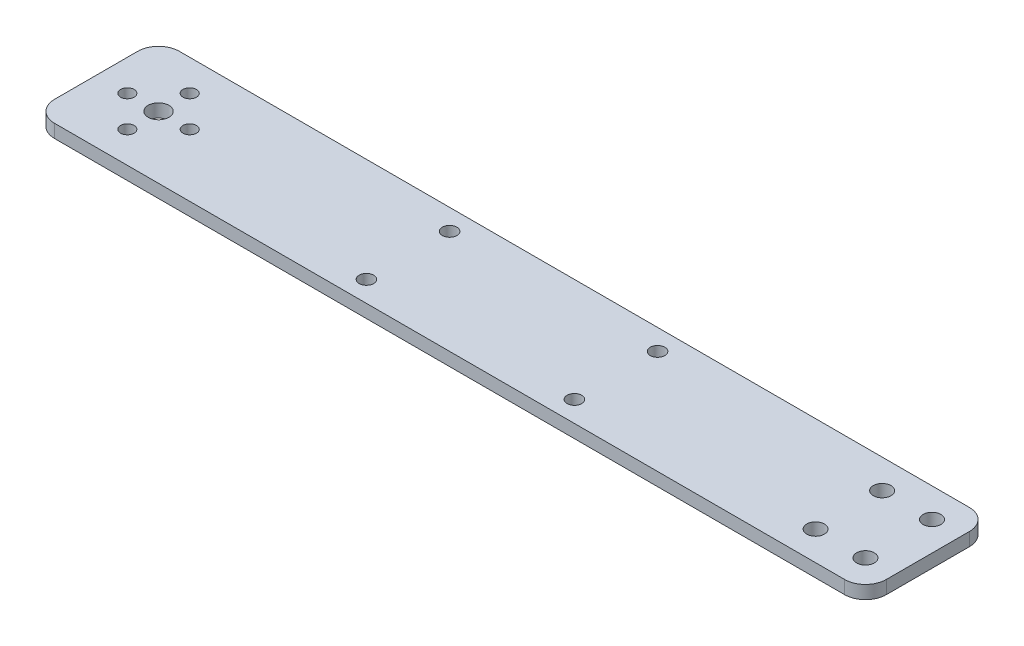
ISO-10303-21;
HEADER;
FILE_DESCRIPTION(('STEP AP214'),'2;1');
FILE_NAME('part.step','',(''),(''),'','','');
FILE_SCHEMA(('AUTOMOTIVE_DESIGN { 1 0 10303 214 1 1 1 1 }'));
ENDSEC;
DATA;
#1=APPLICATION_CONTEXT('core data for automotive mechanical design processes');
#2=APPLICATION_PROTOCOL_DEFINITION('international standard','automotive_design',2000,#1);
#3=PRODUCT_CONTEXT('',#1,'mechanical');
#4=PRODUCT('Part','Part','',(#3));
#5=PRODUCT_RELATED_PRODUCT_CATEGORY('part','',(#4));
#6=PRODUCT_DEFINITION_FORMATION('','',#4);
#7=PRODUCT_DEFINITION_CONTEXT('part definition',#1,'design');
#8=PRODUCT_DEFINITION('design','',#6,#7);
#9=PRODUCT_DEFINITION_SHAPE('','',#8);
#10=(LENGTH_UNIT() NAMED_UNIT(*) SI_UNIT(.MILLI.,.METRE.));
#11=(NAMED_UNIT(*) PLANE_ANGLE_UNIT() SI_UNIT($,.RADIAN.));
#12=(NAMED_UNIT(*) SI_UNIT($,.STERADIAN.) SOLID_ANGLE_UNIT());
#13=UNCERTAINTY_MEASURE_WITH_UNIT(LENGTH_MEASURE(1.E-05),#10,'distance_accuracy_value','');
#14=(GEOMETRIC_REPRESENTATION_CONTEXT(3) GLOBAL_UNCERTAINTY_ASSIGNED_CONTEXT((#13)) GLOBAL_UNIT_ASSIGNED_CONTEXT((#10,
#11,#12)) REPRESENTATION_CONTEXT('',''));
#15=CARTESIAN_POINT('',(0.,0.,0.));
#16=DIRECTION('',(0.,0.,1.));
#17=DIRECTION('',(1.,0.,0.));
#18=AXIS2_PLACEMENT_3D('',#15,#16,#17);
#19=CARTESIAN_POINT('',(-15.,3.175,-15.));
#20=DIRECTION('',(1.,0.,0.));
#21=DIRECTION('',(0.,0.,-1.));
#22=AXIS2_PLACEMENT_3D('',#19,#20,#21);
#23=PLANE('',#22);
#24=DIRECTION('',(0.,0.,1.));
#25=VECTOR('',#24,1.);
#26=CARTESIAN_POINT('',(-15.,3.175,-15.));
#27=LINE('',#26,#25);
#28=CARTESIAN_POINT('',(-15.,3.175,-10.));
#29=VERTEX_POINT('',#28);
#30=CARTESIAN_POINT('',(-15.,3.175,10.));
#31=VERTEX_POINT('',#30);
#32=EDGE_CURVE('E130',#29,#31,#27,.T.);
#33=ORIENTED_EDGE('',*,*,#32,.F.);
#34=DIRECTION('',(0.,-1.,0.));
#35=VECTOR('',#34,1.);
#36=CARTESIAN_POINT('',(-15.,3.175,-10.));
#37=LINE('',#36,#35);
#38=CARTESIAN_POINT('',(-15.,0.,-10.));
#39=VERTEX_POINT('',#38);
#40=EDGE_CURVE('E11',#29,#39,#37,.T.);
#41=ORIENTED_EDGE('',*,*,#40,.T.);
#42=DIRECTION('',(0.,0.,1.));
#43=VECTOR('',#42,1.);
#44=CARTESIAN_POINT('',(-15.,0.,-15.));
#45=LINE('',#44,#43);
#46=CARTESIAN_POINT('',(-15.,0.,10.));
#47=VERTEX_POINT('',#46);
#48=EDGE_CURVE('E132',#39,#47,#45,.T.);
#49=ORIENTED_EDGE('',*,*,#48,.T.);
#50=DIRECTION('',(0.,-1.,0.));
#51=VECTOR('',#50,1.);
#52=CARTESIAN_POINT('',(-15.,3.175,10.));
#53=LINE('',#52,#51);
#54=EDGE_CURVE('E42',#47,#31,#53,.F.);
#55=ORIENTED_EDGE('',*,*,#54,.T.);
#56=EDGE_LOOP('',(#33,#41,#49,#55));
#57=FACE_BOUND('',#56,.T.);
#58=ADVANCED_FACE('F33',(#57),#23,.F.);
#59=CARTESIAN_POINT('',(-15.,3.175,15.));
#60=DIRECTION('',(0.,0.,-1.));
#61=DIRECTION('',(-1.,0.,0.));
#62=AXIS2_PLACEMENT_3D('',#59,#60,#61);
#63=PLANE('',#62);
#64=DIRECTION('',(1.,0.,0.));
#65=VECTOR('',#64,1.);
#66=CARTESIAN_POINT('',(-15.,0.,15.));
#67=LINE('',#66,#65);
#68=CARTESIAN_POINT('',(-9.99999999999999,0.,15.));
#69=VERTEX_POINT('',#68);
#70=CARTESIAN_POINT('',(180.,0.,15.));
#71=VERTEX_POINT('',#70);
#72=EDGE_CURVE('E128',#69,#71,#67,.T.);
#73=ORIENTED_EDGE('',*,*,#72,.T.);
#74=DIRECTION('',(0.,-1.,0.));
#75=VECTOR('',#74,1.);
#76=CARTESIAN_POINT('',(180.,3.175,15.));
#77=LINE('',#76,#75);
#78=CARTESIAN_POINT('',(180.,3.175,15.));
#79=VERTEX_POINT('',#78);
#80=EDGE_CURVE('E107',#71,#79,#77,.F.);
#81=ORIENTED_EDGE('',*,*,#80,.T.);
#82=DIRECTION('',(1.,0.,0.));
#83=VECTOR('',#82,1.);
#84=CARTESIAN_POINT('',(-15.,3.175,15.));
#85=LINE('',#84,#83);
#86=CARTESIAN_POINT('',(-9.99999999999999,3.175,15.));
#87=VERTEX_POINT('',#86);
#88=EDGE_CURVE('E190',#87,#79,#85,.T.);
#89=ORIENTED_EDGE('',*,*,#88,.F.);
#90=DIRECTION('',(0.,-1.,0.));
#91=VECTOR('',#90,1.);
#92=CARTESIAN_POINT('',(-9.99999999999999,3.175,15.));
#93=LINE('',#92,#91);
#94=EDGE_CURVE('E112',#87,#69,#93,.T.);
#95=ORIENTED_EDGE('',*,*,#94,.T.);
#96=EDGE_LOOP('',(#73,#81,#89,#95));
#97=FACE_BOUND('',#96,.T.);
#98=ADVANCED_FACE('F206',(#97),#63,.F.);
#99=CARTESIAN_POINT('',(185.,3.175,-15.));
#100=DIRECTION('',(-1.,0.,0.));
#101=DIRECTION('',(0.,0.,1.));
#102=AXIS2_PLACEMENT_3D('',#99,#100,#101);
#103=PLANE('',#102);
#104=DIRECTION('',(0.,0.,-1.));
#105=VECTOR('',#104,1.);
#106=CARTESIAN_POINT('',(185.,3.175,-15.));
#107=LINE('',#106,#105);
#108=CARTESIAN_POINT('',(185.,3.175,10.));
#109=VERTEX_POINT('',#108);
#110=CARTESIAN_POINT('',(185.,3.175,-10.));
#111=VERTEX_POINT('',#110);
#112=EDGE_CURVE('E121',#109,#111,#107,.T.);
#113=ORIENTED_EDGE('',*,*,#112,.F.);
#114=DIRECTION('',(0.,-1.,0.));
#115=VECTOR('',#114,1.);
#116=CARTESIAN_POINT('',(185.,3.175,10.));
#117=LINE('',#116,#115);
#118=CARTESIAN_POINT('',(185.,0.,10.));
#119=VERTEX_POINT('',#118);
#120=EDGE_CURVE('E106',#109,#119,#117,.T.);
#121=ORIENTED_EDGE('',*,*,#120,.T.);
#122=DIRECTION('',(0.,0.,-1.));
#123=VECTOR('',#122,1.);
#124=CARTESIAN_POINT('',(185.,0.,-15.));
#125=LINE('',#124,#123);
#126=CARTESIAN_POINT('',(185.,0.,-10.));
#127=VERTEX_POINT('',#126);
#128=EDGE_CURVE('E119',#119,#127,#125,.T.);
#129=ORIENTED_EDGE('',*,*,#128,.T.);
#130=DIRECTION('',(0.,-1.,0.));
#131=VECTOR('',#130,1.);
#132=CARTESIAN_POINT('',(185.,3.175,-10.));
#133=LINE('',#132,#131);
#134=EDGE_CURVE('E123',#127,#111,#133,.F.);
#135=ORIENTED_EDGE('',*,*,#134,.T.);
#136=EDGE_LOOP('',(#113,#121,#129,#135));
#137=FACE_BOUND('',#136,.T.);
#138=ADVANCED_FACE('F118',(#137),#103,.F.);
#139=CARTESIAN_POINT('',(-15.,3.175,-15.));
#140=DIRECTION('',(0.,0.,1.));
#141=DIRECTION('',(1.,0.,0.));
#142=AXIS2_PLACEMENT_3D('',#139,#140,#141);
#143=PLANE('',#142);
#144=DIRECTION('',(-1.,0.,0.));
#145=VECTOR('',#144,1.);
#146=CARTESIAN_POINT('',(-15.,3.175,-15.));
#147=LINE('',#146,#145);
#148=CARTESIAN_POINT('',(180.,3.175,-15.));
#149=VERTEX_POINT('',#148);
#150=CARTESIAN_POINT('',(-9.99999999999999,3.175,-15.));
#151=VERTEX_POINT('',#150);
#152=EDGE_CURVE('E136',#149,#151,#147,.T.);
#153=ORIENTED_EDGE('',*,*,#152,.F.);
#154=DIRECTION('',(0.,-1.,0.));
#155=VECTOR('',#154,1.);
#156=CARTESIAN_POINT('',(180.,3.175,-15.));
#157=LINE('',#156,#155);
#158=CARTESIAN_POINT('',(180.,0.,-15.));
#159=VERTEX_POINT('',#158);
#160=EDGE_CURVE('E153',#149,#159,#157,.T.);
#161=ORIENTED_EDGE('',*,*,#160,.T.);
#162=DIRECTION('',(-1.,0.,0.));
#163=VECTOR('',#162,1.);
#164=CARTESIAN_POINT('',(-15.,0.,-15.));
#165=LINE('',#164,#163);
#166=CARTESIAN_POINT('',(-9.99999999999999,0.,-15.));
#167=VERTEX_POINT('',#166);
#168=EDGE_CURVE('E127',#159,#167,#165,.T.);
#169=ORIENTED_EDGE('',*,*,#168,.T.);
#170=DIRECTION('',(0.,-1.,0.));
#171=VECTOR('',#170,1.);
#172=CARTESIAN_POINT('',(-9.99999999999999,3.175,-15.));
#173=LINE('',#172,#171);
#174=EDGE_CURVE('E50',#167,#151,#173,.F.);
#175=ORIENTED_EDGE('',*,*,#174,.T.);
#176=EDGE_LOOP('',(#153,#161,#169,#175));
#177=FACE_BOUND('',#176,.T.);
#178=ADVANCED_FACE('F213',(#177),#143,.F.);
#179=CARTESIAN_POINT('',(0.,3.175,0.));
#180=DIRECTION('',(0.,1.,0.));
#181=DIRECTION('',(0.,0.,1.));
#182=AXIS2_PLACEMENT_3D('',#179,#180,#181);
#183=PLANE('',#182);
#184=CARTESIAN_POINT('',(166.,3.175,8.00000000000001));
#185=DIRECTION('',(0.,1.,0.));
#186=DIRECTION('',(0.,0.,-1.));
#187=AXIS2_PLACEMENT_3D('',#184,#185,#186);
#188=CIRCLE('',#187,2.12499999999998);
#189=CARTESIAN_POINT('',(166.,3.175,5.87500000000003));
#190=VERTEX_POINT('',#189);
#191=EDGE_CURVE('E315',#190,#190,#188,.T.);
#192=ORIENTED_EDGE('',*,*,#191,.F.);
#193=EDGE_LOOP('',(#192));
#194=FACE_BOUND('',#193,.T.);
#195=CARTESIAN_POINT('',(178.,3.175,8.00000000000001));
#196=DIRECTION('',(0.,1.,0.));
#197=DIRECTION('',(0.,0.,1.));
#198=AXIS2_PLACEMENT_3D('',#195,#196,#197);
#199=CIRCLE('',#198,2.12499999999998);
#200=CARTESIAN_POINT('',(178.,3.175,10.125));
#201=VERTEX_POINT('',#200);
#202=EDGE_CURVE('E307',#201,#201,#199,.T.);
#203=ORIENTED_EDGE('',*,*,#202,.F.);
#204=EDGE_LOOP('',(#203));
#205=FACE_BOUND('',#204,.T.);
#206=CARTESIAN_POINT('',(178.,3.175,-7.99999999999999));
#207=DIRECTION('',(0.,1.,0.));
#208=DIRECTION('',(0.,0.,-1.));
#209=AXIS2_PLACEMENT_3D('',#206,#207,#208);
#210=CIRCLE('',#209,2.12499999999998);
#211=CARTESIAN_POINT('',(178.,3.175,-10.125));
#212=VERTEX_POINT('',#211);
#213=EDGE_CURVE('E300',#212,#212,#210,.T.);
#214=ORIENTED_EDGE('',*,*,#213,.F.);
#215=EDGE_LOOP('',(#214));
#216=FACE_BOUND('',#215,.T.);
#217=CARTESIAN_POINT('',(166.,3.175,-7.99999999999999));
#218=DIRECTION('',(0.,1.,0.));
#219=DIRECTION('',(0.,0.,1.));
#220=AXIS2_PLACEMENT_3D('',#217,#218,#219);
#221=CIRCLE('',#220,2.12499999999998);
#222=CARTESIAN_POINT('',(166.,3.175,-5.87500000000002));
#223=VERTEX_POINT('',#222);
#224=EDGE_CURVE('E304',#223,#223,#221,.T.);
#225=ORIENTED_EDGE('',*,*,#224,.F.);
#226=EDGE_LOOP('',(#225));
#227=FACE_BOUND('',#226,.T.);
#228=CARTESIAN_POINT('',(60.,3.175,-9.99999999999999));
#229=DIRECTION('',(0.,1.,0.));
#230=DIRECTION('',(0.,0.,-1.));
#231=AXIS2_PLACEMENT_3D('',#228,#229,#230);
#232=CIRCLE('',#231,1.75);
#233=CARTESIAN_POINT('',(60.,3.175,-11.75));
#234=VERTEX_POINT('',#233);
#235=EDGE_CURVE('E321',#234,#234,#232,.T.);
#236=ORIENTED_EDGE('',*,*,#235,.F.);
#237=EDGE_LOOP('',(#236));
#238=FACE_BOUND('',#237,.T.);
#239=CARTESIAN_POINT('',(110.,3.175,-9.99999999999999));
#240=DIRECTION('',(0.,1.,0.));
#241=DIRECTION('',(0.,0.,1.));
#242=AXIS2_PLACEMENT_3D('',#239,#240,#241);
#243=CIRCLE('',#242,1.75000000000001);
#244=CARTESIAN_POINT('',(110.,3.175,-8.24999999999998));
#245=VERTEX_POINT('',#244);
#246=EDGE_CURVE('E327',#245,#245,#243,.T.);
#247=ORIENTED_EDGE('',*,*,#246,.F.);
#248=EDGE_LOOP('',(#247));
#249=FACE_BOUND('',#248,.T.);
#250=CARTESIAN_POINT('',(110.,3.175,9.99999999999999));
#251=DIRECTION('',(0.,1.,0.));
#252=DIRECTION('',(0.,0.,-1.));
#253=AXIS2_PLACEMENT_3D('',#250,#251,#252);
#254=CIRCLE('',#253,1.75000000000001);
#255=CARTESIAN_POINT('',(110.,3.175,8.24999999999998));
#256=VERTEX_POINT('',#255);
#257=EDGE_CURVE('E324',#256,#256,#254,.T.);
#258=ORIENTED_EDGE('',*,*,#257,.F.);
#259=EDGE_LOOP('',(#258));
#260=FACE_BOUND('',#259,.T.);
#261=CARTESIAN_POINT('',(60.,3.175,9.99999999999999));
#262=DIRECTION('',(0.,1.,0.));
#263=DIRECTION('',(0.,0.,1.));
#264=AXIS2_PLACEMENT_3D('',#261,#262,#263);
#265=CIRCLE('',#264,1.75);
#266=CARTESIAN_POINT('',(60.,3.175,11.75));
#267=VERTEX_POINT('',#266);
#268=EDGE_CURVE('E161',#267,#267,#265,.T.);
#269=ORIENTED_EDGE('',*,*,#268,.F.);
#270=EDGE_LOOP('',(#269));
#271=FACE_BOUND('',#270,.T.);
#272=CARTESIAN_POINT('',(7.5,3.175,0.));
#273=DIRECTION('',(0.,1.,0.));
#274=DIRECTION('',(0.,0.,1.));
#275=AXIS2_PLACEMENT_3D('',#272,#273,#274);
#276=CIRCLE('',#275,1.625);
#277=CARTESIAN_POINT('',(7.5,3.175,1.625));
#278=VERTEX_POINT('',#277);
#279=EDGE_CURVE('E336',#278,#278,#276,.T.);
#280=ORIENTED_EDGE('',*,*,#279,.F.);
#281=EDGE_LOOP('',(#280));
#282=FACE_BOUND('',#281,.T.);
#283=CARTESIAN_POINT('',(0.,3.175,7.5));
#284=DIRECTION('',(0.,1.,0.));
#285=DIRECTION('',(0.,0.,1.));
#286=AXIS2_PLACEMENT_3D('',#283,#284,#285);
#287=CIRCLE('',#286,1.625);
#288=CARTESIAN_POINT('',(0.,3.175,9.125));
#289=VERTEX_POINT('',#288);
#290=EDGE_CURVE('E342',#289,#289,#287,.T.);
#291=ORIENTED_EDGE('',*,*,#290,.F.);
#292=EDGE_LOOP('',(#291));
#293=FACE_BOUND('',#292,.T.);
#294=CARTESIAN_POINT('',(-7.5,3.175,0.));
#295=DIRECTION('',(0.,1.,0.));
#296=DIRECTION('',(0.,0.,1.));
#297=AXIS2_PLACEMENT_3D('',#294,#295,#296);
#298=CIRCLE('',#297,1.625);
#299=CARTESIAN_POINT('',(-7.5,3.175,1.62499999999995));
#300=VERTEX_POINT('',#299);
#301=EDGE_CURVE('E177',#300,#300,#298,.T.);
#302=ORIENTED_EDGE('',*,*,#301,.F.);
#303=EDGE_LOOP('',(#302));
#304=FACE_BOUND('',#303,.T.);
#305=CARTESIAN_POINT('',(0.,3.175,-7.5));
#306=DIRECTION('',(0.,1.,0.));
#307=DIRECTION('',(0.,0.,1.));
#308=AXIS2_PLACEMENT_3D('',#305,#306,#307);
#309=CIRCLE('',#308,1.625);
#310=CARTESIAN_POINT('',(0.,3.175,-5.875));
#311=VERTEX_POINT('',#310);
#312=EDGE_CURVE('E168',#311,#311,#309,.T.);
#313=ORIENTED_EDGE('',*,*,#312,.F.);
#314=EDGE_LOOP('',(#313));
#315=FACE_BOUND('',#314,.T.);
#316=CARTESIAN_POINT('',(0.,3.175,0.));
#317=DIRECTION('',(0.,1.,0.));
#318=DIRECTION('',(0.,0.,1.));
#319=AXIS2_PLACEMENT_3D('',#316,#317,#318);
#320=CIRCLE('',#319,2.5);
#321=CARTESIAN_POINT('',(0.,3.175,2.5));
#322=VERTEX_POINT('',#321);
#323=EDGE_CURVE('E184',#322,#322,#320,.T.);
#324=ORIENTED_EDGE('',*,*,#323,.F.);
#325=EDGE_LOOP('',(#324));
#326=FACE_BOUND('',#325,.T.);
#327=ORIENTED_EDGE('',*,*,#88,.T.);
#328=CARTESIAN_POINT('',(180.,3.175,10.));
#329=DIRECTION('',(0.,1.,0.));
#330=DIRECTION('',(0.,0.,1.));
#331=AXIS2_PLACEMENT_3D('',#328,#329,#330);
#332=CIRCLE('',#331,5.);
#333=EDGE_CURVE('E150',#79,#109,#332,.T.);
#334=ORIENTED_EDGE('',*,*,#333,.T.);
#335=ORIENTED_EDGE('',*,*,#112,.T.);
#336=CARTESIAN_POINT('',(180.,3.175,-10.));
#337=DIRECTION('',(0.,1.,0.));
#338=DIRECTION('',(0.,0.,1.));
#339=AXIS2_PLACEMENT_3D('',#336,#337,#338);
#340=CIRCLE('',#339,5.);
#341=EDGE_CURVE('E57',#111,#149,#340,.T.);
#342=ORIENTED_EDGE('',*,*,#341,.T.);
#343=ORIENTED_EDGE('',*,*,#152,.T.);
#344=CARTESIAN_POINT('',(-9.99999999999999,3.175,-10.));
#345=DIRECTION('',(0.,1.,0.));
#346=DIRECTION('',(0.,0.,1.));
#347=AXIS2_PLACEMENT_3D('',#344,#345,#346);
#348=CIRCLE('',#347,5.);
#349=EDGE_CURVE('E147',#151,#29,#348,.T.);
#350=ORIENTED_EDGE('',*,*,#349,.T.);
#351=ORIENTED_EDGE('',*,*,#32,.T.);
#352=CARTESIAN_POINT('',(-9.99999999999999,3.175,10.));
#353=DIRECTION('',(0.,1.,0.));
#354=DIRECTION('',(0.,0.,1.));
#355=AXIS2_PLACEMENT_3D('',#352,#353,#354);
#356=CIRCLE('',#355,5.);
#357=EDGE_CURVE('E145',#31,#87,#356,.T.);
#358=ORIENTED_EDGE('',*,*,#357,.T.);
#359=EDGE_LOOP('',(#327,#334,#335,#342,#343,#350,#351,#358));
#360=FACE_BOUND('',#359,.T.);
#361=ADVANCED_FACE('F204',(#194,#205,#216,#227,#238,#249,#260,#271,#282,#293,#304,#315,#326,
#360),#183,.T.);
#362=CARTESIAN_POINT('',(0.,0.,0.));
#363=DIRECTION('',(0.,1.,0.));
#364=DIRECTION('',(0.,0.,1.));
#365=AXIS2_PLACEMENT_3D('',#362,#363,#364);
#366=PLANE('',#365);
#367=CARTESIAN_POINT('',(166.,0.,8.00000000000001));
#368=DIRECTION('',(0.,1.,0.));
#369=DIRECTION('',(0.,0.,-1.));
#370=AXIS2_PLACEMENT_3D('',#367,#368,#369);
#371=CIRCLE('',#370,2.12499999999998);
#372=CARTESIAN_POINT('',(166.,0.,5.87500000000003));
#373=VERTEX_POINT('',#372);
#374=EDGE_CURVE('E312',#373,#373,#371,.T.);
#375=ORIENTED_EDGE('',*,*,#374,.T.);
#376=EDGE_LOOP('',(#375));
#377=FACE_BOUND('',#376,.T.);
#378=CARTESIAN_POINT('',(178.,0.,8.00000000000001));
#379=DIRECTION('',(0.,1.,0.));
#380=DIRECTION('',(0.,0.,1.));
#381=AXIS2_PLACEMENT_3D('',#378,#379,#380);
#382=CIRCLE('',#381,2.12499999999998);
#383=CARTESIAN_POINT('',(178.,0.,10.125));
#384=VERTEX_POINT('',#383);
#385=EDGE_CURVE('E302',#384,#384,#382,.T.);
#386=ORIENTED_EDGE('',*,*,#385,.T.);
#387=EDGE_LOOP('',(#386));
#388=FACE_BOUND('',#387,.T.);
#389=CARTESIAN_POINT('',(178.,0.,-7.99999999999999));
#390=DIRECTION('',(0.,1.,0.));
#391=DIRECTION('',(0.,0.,-1.));
#392=AXIS2_PLACEMENT_3D('',#389,#390,#391);
#393=CIRCLE('',#392,2.12499999999998);
#394=CARTESIAN_POINT('',(178.,0.,-10.125));
#395=VERTEX_POINT('',#394);
#396=EDGE_CURVE('E297',#395,#395,#393,.T.);
#397=ORIENTED_EDGE('',*,*,#396,.T.);
#398=EDGE_LOOP('',(#397));
#399=FACE_BOUND('',#398,.T.);
#400=CARTESIAN_POINT('',(166.,0.,-7.99999999999999));
#401=DIRECTION('',(0.,1.,0.));
#402=DIRECTION('',(0.,0.,1.));
#403=AXIS2_PLACEMENT_3D('',#400,#401,#402);
#404=CIRCLE('',#403,2.12499999999998);
#405=CARTESIAN_POINT('',(166.,0.,-5.87500000000002));
#406=VERTEX_POINT('',#405);
#407=EDGE_CURVE('E318',#406,#406,#404,.T.);
#408=ORIENTED_EDGE('',*,*,#407,.T.);
#409=EDGE_LOOP('',(#408));
#410=FACE_BOUND('',#409,.T.);
#411=CARTESIAN_POINT('',(60.,0.,-9.99999999999999));
#412=DIRECTION('',(0.,1.,0.));
#413=DIRECTION('',(0.,0.,1.));
#414=AXIS2_PLACEMENT_3D('',#411,#412,#413);
#415=CIRCLE('',#414,1.75);
#416=CARTESIAN_POINT('',(60.,0.,-8.25));
#417=VERTEX_POINT('',#416);
#418=EDGE_CURVE('E37',#417,#417,#415,.T.);
#419=ORIENTED_EDGE('',*,*,#418,.T.);
#420=EDGE_LOOP('',(#419));
#421=FACE_BOUND('',#420,.T.);
#422=CARTESIAN_POINT('',(110.,0.,-9.99999999999999));
#423=DIRECTION('',(0.,1.,0.));
#424=DIRECTION('',(0.,0.,1.));
#425=AXIS2_PLACEMENT_3D('',#422,#423,#424);
#426=CIRCLE('',#425,1.75000000000001);
#427=CARTESIAN_POINT('',(110.,0.,-8.24999999999998));
#428=VERTEX_POINT('',#427);
#429=EDGE_CURVE('E163',#428,#428,#426,.T.);
#430=ORIENTED_EDGE('',*,*,#429,.T.);
#431=EDGE_LOOP('',(#430));
#432=FACE_BOUND('',#431,.T.);
#433=CARTESIAN_POINT('',(110.,0.,9.99999999999999));
#434=DIRECTION('',(0.,1.,0.));
#435=DIRECTION('',(0.,0.,1.));
#436=AXIS2_PLACEMENT_3D('',#433,#434,#435);
#437=CIRCLE('',#436,1.75000000000001);
#438=CARTESIAN_POINT('',(110.,0.,11.75));
#439=VERTEX_POINT('',#438);
#440=EDGE_CURVE('E160',#439,#439,#437,.T.);
#441=ORIENTED_EDGE('',*,*,#440,.T.);
#442=EDGE_LOOP('',(#441));
#443=FACE_BOUND('',#442,.T.);
#444=CARTESIAN_POINT('',(60.,0.,9.99999999999999));
#445=DIRECTION('',(0.,1.,0.));
#446=DIRECTION('',(0.,0.,1.));
#447=AXIS2_PLACEMENT_3D('',#444,#445,#446);
#448=CIRCLE('',#447,1.75);
#449=CARTESIAN_POINT('',(60.,0.,11.75));
#450=VERTEX_POINT('',#449);
#451=EDGE_CURVE('E157',#450,#450,#448,.T.);
#452=ORIENTED_EDGE('',*,*,#451,.T.);
#453=EDGE_LOOP('',(#452));
#454=FACE_BOUND('',#453,.T.);
#455=CARTESIAN_POINT('',(7.5,0.,0.));
#456=DIRECTION('',(0.,1.,0.));
#457=DIRECTION('',(0.,0.,1.));
#458=AXIS2_PLACEMENT_3D('',#455,#456,#457);
#459=CIRCLE('',#458,1.625);
#460=CARTESIAN_POINT('',(7.5,0.,1.625));
#461=VERTEX_POINT('',#460);
#462=EDGE_CURVE('E187',#461,#461,#459,.T.);
#463=ORIENTED_EDGE('',*,*,#462,.T.);
#464=EDGE_LOOP('',(#463));
#465=FACE_BOUND('',#464,.T.);
#466=CARTESIAN_POINT('',(0.,0.,7.5));
#467=DIRECTION('',(0.,1.,0.));
#468=DIRECTION('',(0.,0.,1.));
#469=AXIS2_PLACEMENT_3D('',#466,#467,#468);
#470=CIRCLE('',#469,1.625);
#471=CARTESIAN_POINT('',(0.,0.,9.125));
#472=VERTEX_POINT('',#471);
#473=EDGE_CURVE('E339',#472,#472,#470,.T.);
#474=ORIENTED_EDGE('',*,*,#473,.T.);
#475=EDGE_LOOP('',(#474));
#476=FACE_BOUND('',#475,.T.);
#477=CARTESIAN_POINT('',(-7.5,0.,0.));
#478=DIRECTION('',(0.,1.,0.));
#479=DIRECTION('',(0.,0.,1.));
#480=AXIS2_PLACEMENT_3D('',#477,#478,#479);
#481=CIRCLE('',#480,1.625);
#482=CARTESIAN_POINT('',(-7.5,0.,1.62499999999995));
#483=VERTEX_POINT('',#482);
#484=EDGE_CURVE('E345',#483,#483,#481,.T.);
#485=ORIENTED_EDGE('',*,*,#484,.T.);
#486=EDGE_LOOP('',(#485));
#487=FACE_BOUND('',#486,.T.);
#488=CARTESIAN_POINT('',(0.,0.,-7.5));
#489=DIRECTION('',(0.,1.,0.));
#490=DIRECTION('',(0.,0.,1.));
#491=AXIS2_PLACEMENT_3D('',#488,#489,#490);
#492=CIRCLE('',#491,1.625);
#493=CARTESIAN_POINT('',(0.,0.,-5.875));
#494=VERTEX_POINT('',#493);
#495=EDGE_CURVE('E172',#494,#494,#492,.T.);
#496=ORIENTED_EDGE('',*,*,#495,.T.);
#497=EDGE_LOOP('',(#496));
#498=FACE_BOUND('',#497,.T.);
#499=CARTESIAN_POINT('',(0.,0.,0.));
#500=DIRECTION('',(0.,1.,0.));
#501=DIRECTION('',(0.,0.,1.));
#502=AXIS2_PLACEMENT_3D('',#499,#500,#501);
#503=CIRCLE('',#502,2.5);
#504=CARTESIAN_POINT('',(0.,0.,2.5));
#505=VERTEX_POINT('',#504);
#506=EDGE_CURVE('E181',#505,#505,#503,.T.);
#507=ORIENTED_EDGE('',*,*,#506,.T.);
#508=EDGE_LOOP('',(#507));
#509=FACE_BOUND('',#508,.T.);
#510=ORIENTED_EDGE('',*,*,#128,.F.);
#511=CARTESIAN_POINT('',(180.,0.,10.));
#512=DIRECTION('',(0.,1.,0.));
#513=DIRECTION('',(0.,0.,1.));
#514=AXIS2_PLACEMENT_3D('',#511,#512,#513);
#515=CIRCLE('',#514,5.);
#516=EDGE_CURVE('E102',#119,#71,#515,.F.);
#517=ORIENTED_EDGE('',*,*,#516,.T.);
#518=ORIENTED_EDGE('',*,*,#72,.F.);
#519=CARTESIAN_POINT('',(-9.99999999999999,0.,10.));
#520=DIRECTION('',(0.,1.,0.));
#521=DIRECTION('',(0.,0.,1.));
#522=AXIS2_PLACEMENT_3D('',#519,#520,#521);
#523=CIRCLE('',#522,5.);
#524=EDGE_CURVE('E122',#69,#47,#523,.F.);
#525=ORIENTED_EDGE('',*,*,#524,.T.);
#526=ORIENTED_EDGE('',*,*,#48,.F.);
#527=CARTESIAN_POINT('',(-9.99999999999999,0.,-10.));
#528=DIRECTION('',(0.,1.,0.));
#529=DIRECTION('',(0.,0.,1.));
#530=AXIS2_PLACEMENT_3D('',#527,#528,#529);
#531=CIRCLE('',#530,5.);
#532=EDGE_CURVE('E139',#39,#167,#531,.F.);
#533=ORIENTED_EDGE('',*,*,#532,.T.);
#534=ORIENTED_EDGE('',*,*,#168,.F.);
#535=CARTESIAN_POINT('',(180.,0.,-10.));
#536=DIRECTION('',(0.,1.,0.));
#537=DIRECTION('',(0.,0.,1.));
#538=AXIS2_PLACEMENT_3D('',#535,#536,#537);
#539=CIRCLE('',#538,5.);
#540=EDGE_CURVE('E113',#159,#127,#539,.F.);
#541=ORIENTED_EDGE('',*,*,#540,.T.);
#542=EDGE_LOOP('',(#510,#517,#518,#525,#526,#533,#534,#541));
#543=FACE_BOUND('',#542,.T.);
#544=ADVANCED_FACE('F125',(#377,#388,#399,#410,#421,#432,#443,#454,#465,#476,#487,#498,#509,
#543),#366,.F.);
#545=CARTESIAN_POINT('',(180.,3.175,10.));
#546=DIRECTION('',(0.,-1.,0.));
#547=DIRECTION('',(0.,0.,-1.));
#548=AXIS2_PLACEMENT_3D('',#545,#546,#547);
#549=CYLINDRICAL_SURFACE('',#548,5.);
#550=ORIENTED_EDGE('',*,*,#333,.F.);
#551=ORIENTED_EDGE('',*,*,#80,.F.);
#552=ORIENTED_EDGE('',*,*,#516,.F.);
#553=ORIENTED_EDGE('',*,*,#120,.F.);
#554=EDGE_LOOP('',(#550,#551,#552,#553));
#555=FACE_BOUND('',#554,.T.);
#556=ADVANCED_FACE('F105',(#555),#549,.T.);
#557=CARTESIAN_POINT('',(180.,3.175,-10.));
#558=DIRECTION('',(0.,-1.,0.));
#559=DIRECTION('',(0.,0.,-1.));
#560=AXIS2_PLACEMENT_3D('',#557,#558,#559);
#561=CYLINDRICAL_SURFACE('',#560,5.);
#562=ORIENTED_EDGE('',*,*,#341,.F.);
#563=ORIENTED_EDGE('',*,*,#134,.F.);
#564=ORIENTED_EDGE('',*,*,#540,.F.);
#565=ORIENTED_EDGE('',*,*,#160,.F.);
#566=EDGE_LOOP('',(#562,#563,#564,#565));
#567=FACE_BOUND('',#566,.T.);
#568=ADVANCED_FACE('F220',(#567),#561,.T.);
#569=CARTESIAN_POINT('',(-9.99999999999999,3.175,-10.));
#570=DIRECTION('',(0.,-1.,0.));
#571=DIRECTION('',(0.,0.,-1.));
#572=AXIS2_PLACEMENT_3D('',#569,#570,#571);
#573=CYLINDRICAL_SURFACE('',#572,5.);
#574=ORIENTED_EDGE('',*,*,#349,.F.);
#575=ORIENTED_EDGE('',*,*,#174,.F.);
#576=ORIENTED_EDGE('',*,*,#532,.F.);
#577=ORIENTED_EDGE('',*,*,#40,.F.);
#578=EDGE_LOOP('',(#574,#575,#576,#577));
#579=FACE_BOUND('',#578,.T.);
#580=ADVANCED_FACE('F222',(#579),#573,.T.);
#581=CARTESIAN_POINT('',(-9.99999999999999,3.175,10.));
#582=DIRECTION('',(0.,-1.,0.));
#583=DIRECTION('',(0.,0.,-1.));
#584=AXIS2_PLACEMENT_3D('',#581,#582,#583);
#585=CYLINDRICAL_SURFACE('',#584,5.);
#586=ORIENTED_EDGE('',*,*,#357,.F.);
#587=ORIENTED_EDGE('',*,*,#54,.F.);
#588=ORIENTED_EDGE('',*,*,#524,.F.);
#589=ORIENTED_EDGE('',*,*,#94,.F.);
#590=EDGE_LOOP('',(#586,#587,#588,#589));
#591=FACE_BOUND('',#590,.T.);
#592=ADVANCED_FACE('F35',(#591),#585,.T.);
#593=CARTESIAN_POINT('',(0.,0.,0.));
#594=DIRECTION('',(0.,1.,0.));
#595=DIRECTION('',(0.,0.,1.));
#596=AXIS2_PLACEMENT_3D('',#593,#594,#595);
#597=CYLINDRICAL_SURFACE('',#596,2.5);
#598=ORIENTED_EDGE('',*,*,#506,.F.);
#599=EDGE_LOOP('',(#598));
#600=FACE_BOUND('',#599,.T.);
#601=ORIENTED_EDGE('',*,*,#323,.T.);
#602=EDGE_LOOP('',(#601));
#603=FACE_BOUND('',#602,.T.);
#604=ADVANCED_FACE('F229',(#600,#603),#597,.F.);
#605=CARTESIAN_POINT('',(0.,0.,-7.5));
#606=DIRECTION('',(0.,1.,0.));
#607=DIRECTION('',(0.,0.,1.));
#608=AXIS2_PLACEMENT_3D('',#605,#606,#607);
#609=CYLINDRICAL_SURFACE('',#608,1.625);
#610=ORIENTED_EDGE('',*,*,#495,.F.);
#611=EDGE_LOOP('',(#610));
#612=FACE_BOUND('',#611,.T.);
#613=ORIENTED_EDGE('',*,*,#312,.T.);
#614=EDGE_LOOP('',(#613));
#615=FACE_BOUND('',#614,.T.);
#616=ADVANCED_FACE('F244',(#612,#615),#609,.F.);
#617=CARTESIAN_POINT('',(-7.5,0.,0.));
#618=DIRECTION('',(0.,1.,0.));
#619=DIRECTION('',(0.,0.,1.));
#620=AXIS2_PLACEMENT_3D('',#617,#618,#619);
#621=CYLINDRICAL_SURFACE('',#620,1.625);
#622=ORIENTED_EDGE('',*,*,#484,.F.);
#623=EDGE_LOOP('',(#622));
#624=FACE_BOUND('',#623,.T.);
#625=ORIENTED_EDGE('',*,*,#301,.T.);
#626=EDGE_LOOP('',(#625));
#627=FACE_BOUND('',#626,.T.);
#628=ADVANCED_FACE('F248',(#624,#627),#621,.F.);
#629=CARTESIAN_POINT('',(0.,0.,7.5));
#630=DIRECTION('',(0.,1.,0.));
#631=DIRECTION('',(0.,0.,1.));
#632=AXIS2_PLACEMENT_3D('',#629,#630,#631);
#633=CYLINDRICAL_SURFACE('',#632,1.625);
#634=ORIENTED_EDGE('',*,*,#473,.F.);
#635=EDGE_LOOP('',(#634));
#636=FACE_BOUND('',#635,.T.);
#637=ORIENTED_EDGE('',*,*,#290,.T.);
#638=EDGE_LOOP('',(#637));
#639=FACE_BOUND('',#638,.T.);
#640=ADVANCED_FACE('F252',(#636,#639),#633,.F.);
#641=CARTESIAN_POINT('',(7.5,0.,0.));
#642=DIRECTION('',(0.,1.,0.));
#643=DIRECTION('',(0.,0.,1.));
#644=AXIS2_PLACEMENT_3D('',#641,#642,#643);
#645=CYLINDRICAL_SURFACE('',#644,1.625);
#646=ORIENTED_EDGE('',*,*,#462,.F.);
#647=EDGE_LOOP('',(#646));
#648=FACE_BOUND('',#647,.T.);
#649=ORIENTED_EDGE('',*,*,#279,.T.);
#650=EDGE_LOOP('',(#649));
#651=FACE_BOUND('',#650,.T.);
#652=ADVANCED_FACE('F256',(#648,#651),#645,.F.);
#653=CARTESIAN_POINT('',(60.,-6.825,9.99999999999999));
#654=DIRECTION('',(0.,1.,0.));
#655=DIRECTION('',(0.,0.,1.));
#656=AXIS2_PLACEMENT_3D('',#653,#654,#655);
#657=CYLINDRICAL_SURFACE('',#656,1.75);
#658=ORIENTED_EDGE('',*,*,#268,.T.);
#659=EDGE_LOOP('',(#658));
#660=FACE_BOUND('',#659,.T.);
#661=ORIENTED_EDGE('',*,*,#451,.F.);
#662=EDGE_LOOP('',(#661));
#663=FACE_BOUND('',#662,.T.);
#664=ADVANCED_FACE('F260',(#660,#663),#657,.F.);
#665=CARTESIAN_POINT('',(110.,-6.825,9.99999999999999));
#666=DIRECTION('',(0.,1.,0.));
#667=DIRECTION('',(0.,0.,1.));
#668=AXIS2_PLACEMENT_3D('',#665,#666,#667);
#669=CYLINDRICAL_SURFACE('',#668,1.75000000000001);
#670=ORIENTED_EDGE('',*,*,#257,.T.);
#671=EDGE_LOOP('',(#670));
#672=FACE_BOUND('',#671,.T.);
#673=ORIENTED_EDGE('',*,*,#440,.F.);
#674=EDGE_LOOP('',(#673));
#675=FACE_BOUND('',#674,.T.);
#676=ADVANCED_FACE('F264',(#672,#675),#669,.F.);
#677=CARTESIAN_POINT('',(110.,-6.825,-9.99999999999999));
#678=DIRECTION('',(0.,1.,0.));
#679=DIRECTION('',(0.,0.,1.));
#680=AXIS2_PLACEMENT_3D('',#677,#678,#679);
#681=CYLINDRICAL_SURFACE('',#680,1.75000000000001);
#682=ORIENTED_EDGE('',*,*,#246,.T.);
#683=EDGE_LOOP('',(#682));
#684=FACE_BOUND('',#683,.T.);
#685=ORIENTED_EDGE('',*,*,#429,.F.);
#686=EDGE_LOOP('',(#685));
#687=FACE_BOUND('',#686,.T.);
#688=ADVANCED_FACE('F270',(#684,#687),#681,.F.);
#689=CARTESIAN_POINT('',(60.,-6.825,-9.99999999999999));
#690=DIRECTION('',(0.,1.,0.));
#691=DIRECTION('',(0.,0.,1.));
#692=AXIS2_PLACEMENT_3D('',#689,#690,#691);
#693=CYLINDRICAL_SURFACE('',#692,1.75);
#694=ORIENTED_EDGE('',*,*,#235,.T.);
#695=EDGE_LOOP('',(#694));
#696=FACE_BOUND('',#695,.T.);
#697=ORIENTED_EDGE('',*,*,#418,.F.);
#698=EDGE_LOOP('',(#697));
#699=FACE_BOUND('',#698,.T.);
#700=ADVANCED_FACE('F266',(#696,#699),#693,.F.);
#701=CARTESIAN_POINT('',(166.,0.,-7.99999999999999));
#702=DIRECTION('',(0.,1.,0.));
#703=DIRECTION('',(0.,0.,1.));
#704=AXIS2_PLACEMENT_3D('',#701,#702,#703);
#705=CYLINDRICAL_SURFACE('',#704,2.12499999999998);
#706=ORIENTED_EDGE('',*,*,#407,.F.);
#707=EDGE_LOOP('',(#706));
#708=FACE_BOUND('',#707,.T.);
#709=ORIENTED_EDGE('',*,*,#224,.T.);
#710=EDGE_LOOP('',(#709));
#711=FACE_BOUND('',#710,.T.);
#712=ADVANCED_FACE('F269',(#708,#711),#705,.F.);
#713=CARTESIAN_POINT('',(178.,0.,-7.99999999999999));
#714=DIRECTION('',(0.,1.,0.));
#715=DIRECTION('',(0.,0.,1.));
#716=AXIS2_PLACEMENT_3D('',#713,#714,#715);
#717=CYLINDRICAL_SURFACE('',#716,2.12499999999998);
#718=ORIENTED_EDGE('',*,*,#396,.F.);
#719=EDGE_LOOP('',(#718));
#720=FACE_BOUND('',#719,.T.);
#721=ORIENTED_EDGE('',*,*,#213,.T.);
#722=EDGE_LOOP('',(#721));
#723=FACE_BOUND('',#722,.T.);
#724=ADVANCED_FACE('F280',(#720,#723),#717,.F.);
#725=CARTESIAN_POINT('',(178.,0.,8.00000000000001));
#726=DIRECTION('',(0.,1.,0.));
#727=DIRECTION('',(0.,0.,1.));
#728=AXIS2_PLACEMENT_3D('',#725,#726,#727);
#729=CYLINDRICAL_SURFACE('',#728,2.12499999999998);
#730=ORIENTED_EDGE('',*,*,#385,.F.);
#731=EDGE_LOOP('',(#730));
#732=FACE_BOUND('',#731,.T.);
#733=ORIENTED_EDGE('',*,*,#202,.T.);
#734=EDGE_LOOP('',(#733));
#735=FACE_BOUND('',#734,.T.);
#736=ADVANCED_FACE('F285',(#732,#735),#729,.F.);
#737=CARTESIAN_POINT('',(166.,0.,8.00000000000001));
#738=DIRECTION('',(0.,1.,0.));
#739=DIRECTION('',(0.,0.,1.));
#740=AXIS2_PLACEMENT_3D('',#737,#738,#739);
#741=CYLINDRICAL_SURFACE('',#740,2.12499999999998);
#742=ORIENTED_EDGE('',*,*,#374,.F.);
#743=EDGE_LOOP('',(#742));
#744=FACE_BOUND('',#743,.T.);
#745=ORIENTED_EDGE('',*,*,#191,.T.);
#746=EDGE_LOOP('',(#745));
#747=FACE_BOUND('',#746,.T.);
#748=ADVANCED_FACE('F282',(#744,#747),#741,.F.);
#749=CLOSED_SHELL('',(#58,#98,#138,#178,#361,#544,#556,#568,#580,#592,#604,#616,#628,#640,#652,
#664,#676,#688,#700,#712,#724,#736,#748));
#750=MANIFOLD_SOLID_BREP('B2',#749);
#751=ADVANCED_BREP_SHAPE_REPRESENTATION('',(#18,#750),#14);
#752=SHAPE_DEFINITION_REPRESENTATION(#9,#751);
ENDSEC;
END-ISO-10303-21;
